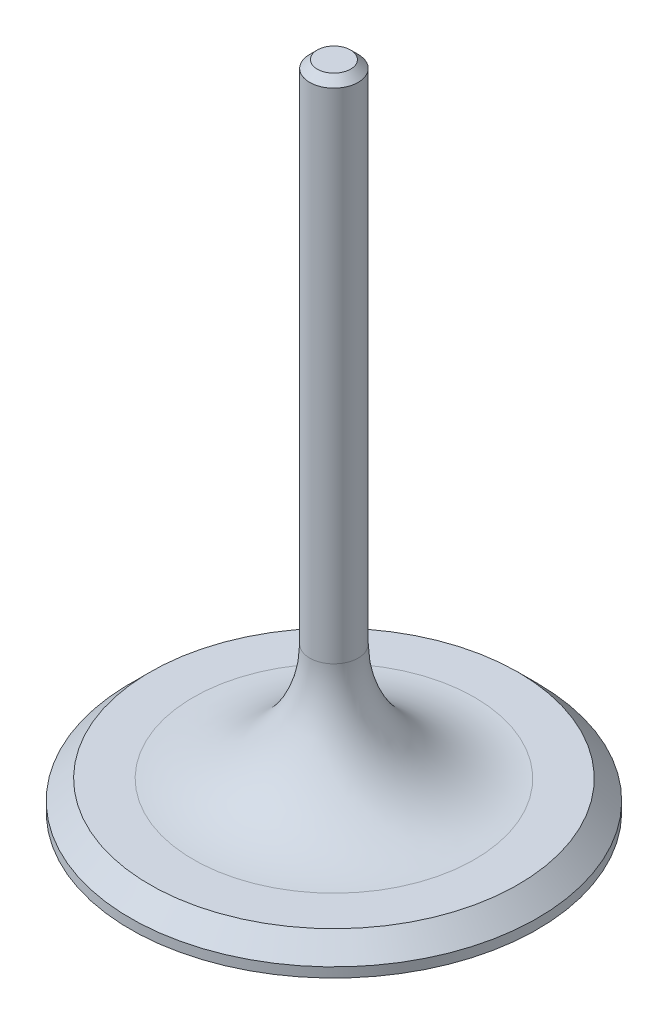
ISO-10303-21;
HEADER;
FILE_DESCRIPTION(('STEP AP214'),'2;1');
FILE_NAME('part.step','',(''),(''),'','','');
FILE_SCHEMA(('AUTOMOTIVE_DESIGN { 1 0 10303 214 1 1 1 1 }'));
ENDSEC;
DATA;
#1=APPLICATION_CONTEXT('core data for automotive mechanical design processes');
#2=APPLICATION_PROTOCOL_DEFINITION('international standard','automotive_design',2000,#1);
#3=PRODUCT_CONTEXT('',#1,'mechanical');
#4=PRODUCT('Part','Part','',(#3));
#5=PRODUCT_RELATED_PRODUCT_CATEGORY('part','',(#4));
#6=PRODUCT_DEFINITION_FORMATION('','',#4);
#7=PRODUCT_DEFINITION_CONTEXT('part definition',#1,'design');
#8=PRODUCT_DEFINITION('design','',#6,#7);
#9=PRODUCT_DEFINITION_SHAPE('','',#8);
#10=(LENGTH_UNIT() NAMED_UNIT(*) SI_UNIT(.MILLI.,.METRE.));
#11=(NAMED_UNIT(*) PLANE_ANGLE_UNIT() SI_UNIT($,.RADIAN.));
#12=(NAMED_UNIT(*) SI_UNIT($,.STERADIAN.) SOLID_ANGLE_UNIT());
#13=UNCERTAINTY_MEASURE_WITH_UNIT(LENGTH_MEASURE(1.E-05),#10,'distance_accuracy_value','');
#14=(GEOMETRIC_REPRESENTATION_CONTEXT(3) GLOBAL_UNCERTAINTY_ASSIGNED_CONTEXT((#13)) GLOBAL_UNIT_ASSIGNED_CONTEXT((#10,
#11,#12)) REPRESENTATION_CONTEXT('',''));
#15=CARTESIAN_POINT('',(0.,0.,0.));
#16=DIRECTION('',(0.,0.,1.));
#17=DIRECTION('',(1.,0.,0.));
#18=AXIS2_PLACEMENT_3D('',#15,#16,#17);
#19=CARTESIAN_POINT('',(0.,0.,0.));
#20=DIRECTION('',(0.,1.,0.));
#21=DIRECTION('',(0.,0.,1.));
#22=AXIS2_PLACEMENT_3D('',#19,#20,#21);
#23=PLANE('',#22);
#24=CARTESIAN_POINT('',(0.,0.,0.));
#25=DIRECTION('',(0.,-1.,0.));
#26=DIRECTION('',(0.,0.,-1.));
#27=AXIS2_PLACEMENT_3D('',#24,#25,#26);
#28=CIRCLE('',#27,26.67);
#29=CARTESIAN_POINT('',(0.,0.,-26.67));
#30=VERTEX_POINT('',#29);
#31=EDGE_CURVE('E58',#30,#30,#28,.T.);
#32=ORIENTED_EDGE('',*,*,#31,.T.);
#33=EDGE_LOOP('',(#32));
#34=FACE_BOUND('',#33,.T.);
#35=ADVANCED_FACE('F37',(#34),#23,.F.);
#36=CARTESIAN_POINT('',(0.,0.,0.));
#37=DIRECTION('',(0.,-1.,0.));
#38=DIRECTION('',(0.,0.,-1.));
#39=AXIS2_PLACEMENT_3D('',#36,#37,#38);
#40=CYLINDRICAL_SURFACE('',#39,26.67);
#41=ORIENTED_EDGE('',*,*,#31,.F.);
#42=EDGE_LOOP('',(#41));
#43=FACE_BOUND('',#42,.T.);
#44=CARTESIAN_POINT('',(0.,1.27,0.));
#45=DIRECTION('',(0.,-1.,0.));
#46=DIRECTION('',(0.,0.,-1.));
#47=AXIS2_PLACEMENT_3D('',#44,#45,#46);
#48=CIRCLE('',#47,26.67);
#49=CARTESIAN_POINT('',(0.,1.27,-26.67));
#50=VERTEX_POINT('',#49);
#51=EDGE_CURVE('E61',#50,#50,#48,.T.);
#52=ORIENTED_EDGE('',*,*,#51,.T.);
#53=EDGE_LOOP('',(#52));
#54=FACE_BOUND('',#53,.T.);
#55=ADVANCED_FACE('F81',(#43,#54),#40,.T.);
#56=CARTESIAN_POINT('',(0.,3.8085133444597,0.));
#57=DIRECTION('',(0.,-1.,0.));
#58=DIRECTION('',(0.,0.,-1.));
#59=AXIS2_PLACEMENT_3D('',#56,#57,#58);
#60=CONICAL_SURFACE('',#59,24.1314866555403,0.785398163397448);
#61=ORIENTED_EDGE('',*,*,#51,.F.);
#62=EDGE_LOOP('',(#61));
#63=FACE_BOUND('',#62,.T.);
#64=CARTESIAN_POINT('',(0.,3.8085133444597,0.));
#65=DIRECTION('',(0.,-1.,0.));
#66=DIRECTION('',(0.,0.,-1.));
#67=AXIS2_PLACEMENT_3D('',#64,#65,#66);
#68=CIRCLE('',#67,24.1314866555403);
#69=CARTESIAN_POINT('',(0.,3.8085133444597,-24.1314866555403));
#70=VERTEX_POINT('',#69);
#71=EDGE_CURVE('E64',#70,#70,#68,.T.);
#72=ORIENTED_EDGE('',*,*,#71,.T.);
#73=EDGE_LOOP('',(#72));
#74=FACE_BOUND('',#73,.T.);
#75=ADVANCED_FACE('F68',(#63,#74),#60,.T.);
#76=CARTESIAN_POINT('',(-24.1314866555403,3.80851334445971,0.));
#77=DIRECTION('',(0.,-1.,0.));
#78=DIRECTION('',(0.,0.,-1.));
#79=AXIS2_PLACEMENT_3D('',#76,#77,#78);
#80=PLANE('',#79);
#81=CARTESIAN_POINT('',(0.,3.80851334445971,0.));
#82=DIRECTION('',(0.,-1.,0.));
#83=DIRECTION('',(0.,0.,-1.));
#84=AXIS2_PLACEMENT_3D('',#81,#82,#83);
#85=CIRCLE('',#84,18.43);
#86=CARTESIAN_POINT('',(0.,3.80851334445971,-18.43));
#87=VERTEX_POINT('',#86);
#88=EDGE_CURVE('E53',#87,#87,#85,.T.);
#89=ORIENTED_EDGE('',*,*,#88,.T.);
#90=EDGE_LOOP('',(#89));
#91=FACE_BOUND('',#90,.T.);
#92=ORIENTED_EDGE('',*,*,#71,.F.);
#93=EDGE_LOOP('',(#92));
#94=FACE_BOUND('',#93,.T.);
#95=ADVANCED_FACE('F70',(#91,#94),#80,.F.);
#96=CARTESIAN_POINT('',(0.,0.,0.));
#97=DIRECTION('',(0.,-1.,0.));
#98=DIRECTION('',(0.,0.,-1.));
#99=AXIS2_PLACEMENT_3D('',#96,#97,#98);
#100=CYLINDRICAL_SURFACE('',#99,3.18);
#101=CARTESIAN_POINT('',(0.,84.4085133444597,0.));
#102=DIRECTION('',(0.,-1.,0.));
#103=DIRECTION('',(0.,0.,-1.));
#104=AXIS2_PLACEMENT_3D('',#101,#102,#103);
#105=CIRCLE('',#104,3.18);
#106=CARTESIAN_POINT('',(0.,84.4085133444597,-3.18));
#107=VERTEX_POINT('',#106);
#108=EDGE_CURVE('E45',#107,#107,#105,.T.);
#109=ORIENTED_EDGE('',*,*,#108,.T.);
#110=EDGE_LOOP('',(#109));
#111=FACE_BOUND('',#110,.T.);
#112=CARTESIAN_POINT('',(0.,19.0585133444597,0.));
#113=DIRECTION('',(0.,-1.,0.));
#114=DIRECTION('',(0.,0.,-1.));
#115=AXIS2_PLACEMENT_3D('',#112,#113,#114);
#116=CIRCLE('',#115,3.18);
#117=CARTESIAN_POINT('',(0.,19.0585133444597,-3.18));
#118=VERTEX_POINT('',#117);
#119=EDGE_CURVE('E49',#118,#118,#116,.F.);
#120=ORIENTED_EDGE('',*,*,#119,.T.);
#121=EDGE_LOOP('',(#120));
#122=FACE_BOUND('',#121,.T.);
#123=ADVANCED_FACE('F72',(#111,#122),#100,.T.);
#124=CARTESIAN_POINT('',(-3.18,85.4085133444597,0.));
#125=DIRECTION('',(0.,-1.,0.));
#126=DIRECTION('',(0.,0.,-1.));
#127=AXIS2_PLACEMENT_3D('',#124,#125,#126);
#128=PLANE('',#127);
#129=CARTESIAN_POINT('',(0.,85.4085133444597,0.));
#130=DIRECTION('',(0.,-1.,0.));
#131=DIRECTION('',(0.,0.,-1.));
#132=AXIS2_PLACEMENT_3D('',#129,#130,#131);
#133=CIRCLE('',#132,2.18);
#134=CARTESIAN_POINT('',(0.,85.4085133444597,-2.18));
#135=VERTEX_POINT('',#134);
#136=EDGE_CURVE('E10',#135,#135,#133,.F.);
#137=ORIENTED_EDGE('',*,*,#136,.T.);
#138=EDGE_LOOP('',(#137));
#139=FACE_BOUND('',#138,.T.);
#140=ADVANCED_FACE('F79',(#139),#128,.F.);
#141=CARTESIAN_POINT('',(0.,19.0585133444597,0.));
#142=DIRECTION('',(0.,-1.,0.));
#143=DIRECTION('',(0.,0.,-1.));
#144=AXIS2_PLACEMENT_3D('',#141,#142,#143);
#145=TOROIDAL_SURFACE('',#144,18.43,15.25);
#146=ORIENTED_EDGE('',*,*,#119,.F.);
#147=EDGE_LOOP('',(#146));
#148=FACE_BOUND('',#147,.T.);
#149=ORIENTED_EDGE('',*,*,#88,.F.);
#150=EDGE_LOOP('',(#149));
#151=FACE_BOUND('',#150,.T.);
#152=ADVANCED_FACE('F92',(#148,#151),#145,.F.);
#153=CARTESIAN_POINT('',(0.,84.4085133444597,0.));
#154=DIRECTION('',(0.,-1.,0.));
#155=DIRECTION('',(0.,0.,-1.));
#156=AXIS2_PLACEMENT_3D('',#153,#154,#155);
#157=CONICAL_SURFACE('',#156,3.18,0.78539816339744);
#158=ORIENTED_EDGE('',*,*,#136,.F.);
#159=EDGE_LOOP('',(#158));
#160=FACE_BOUND('',#159,.T.);
#161=ORIENTED_EDGE('',*,*,#108,.F.);
#162=EDGE_LOOP('',(#161));
#163=FACE_BOUND('',#162,.T.);
#164=ADVANCED_FACE('F40',(#160,#163),#157,.T.);
#165=CLOSED_SHELL('',(#35,#55,#75,#95,#123,#140,#152,#164));
#166=MANIFOLD_SOLID_BREP('B2',#165);
#167=ADVANCED_BREP_SHAPE_REPRESENTATION('',(#18,#166),#14);
#168=SHAPE_DEFINITION_REPRESENTATION(#9,#167);
ENDSEC;
END-ISO-10303-21;
